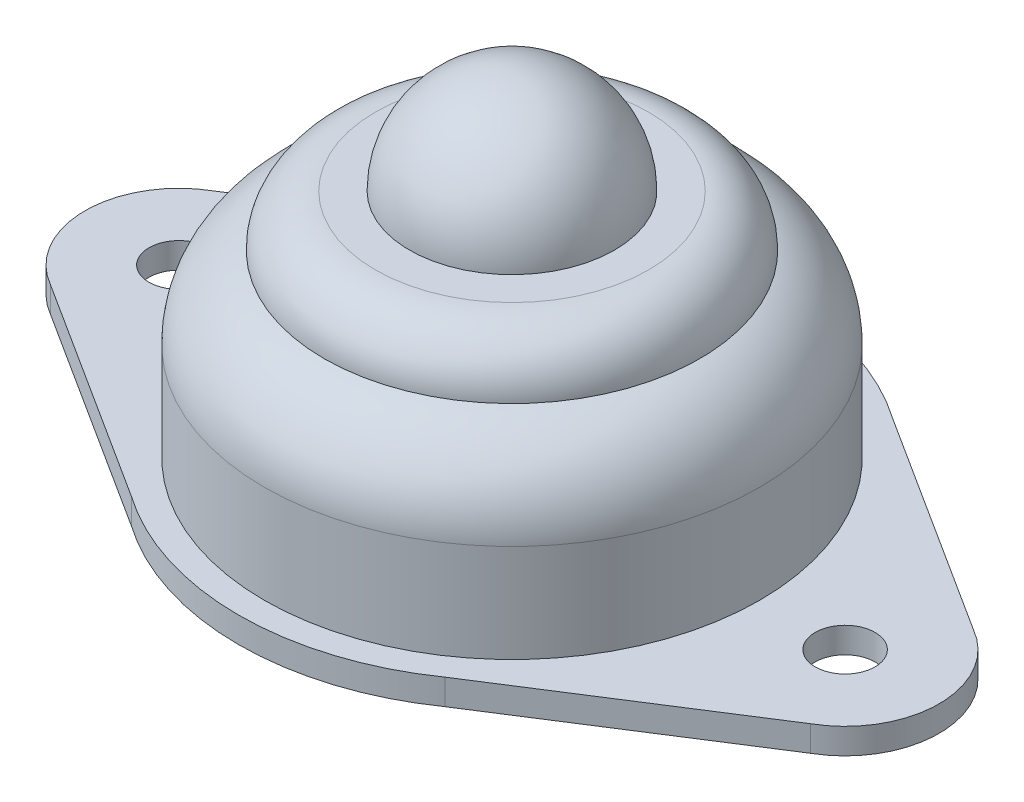
ISO-10303-21;
HEADER;
FILE_DESCRIPTION(('STEP AP214'),'2;1');
FILE_NAME('part.step','',(''),(''),'','','');
FILE_SCHEMA(('AUTOMOTIVE_DESIGN { 1 0 10303 214 1 1 1 1 }'));
ENDSEC;
DATA;
#1=APPLICATION_CONTEXT('core data for automotive mechanical design processes');
#2=APPLICATION_PROTOCOL_DEFINITION('international standard','automotive_design',2000,#1);
#3=PRODUCT_CONTEXT('',#1,'mechanical');
#4=PRODUCT('Part','Part','',(#3));
#5=PRODUCT_RELATED_PRODUCT_CATEGORY('part','',(#4));
#6=PRODUCT_DEFINITION_FORMATION('','',#4);
#7=PRODUCT_DEFINITION_CONTEXT('part definition',#1,'design');
#8=PRODUCT_DEFINITION('design','',#6,#7);
#9=PRODUCT_DEFINITION_SHAPE('','',#8);
#10=(LENGTH_UNIT() NAMED_UNIT(*) SI_UNIT(.MILLI.,.METRE.));
#11=(NAMED_UNIT(*) PLANE_ANGLE_UNIT() SI_UNIT($,.RADIAN.));
#12=(NAMED_UNIT(*) SI_UNIT($,.STERADIAN.) SOLID_ANGLE_UNIT());
#13=UNCERTAINTY_MEASURE_WITH_UNIT(LENGTH_MEASURE(1.E-05),#10,'distance_accuracy_value','');
#14=(GEOMETRIC_REPRESENTATION_CONTEXT(3) GLOBAL_UNCERTAINTY_ASSIGNED_CONTEXT((#13)) GLOBAL_UNIT_ASSIGNED_CONTEXT((#10,
#11,#12)) REPRESENTATION_CONTEXT('',''));
#15=CARTESIAN_POINT('',(0.,0.,0.));
#16=DIRECTION('',(0.,0.,1.));
#17=DIRECTION('',(1.,0.,0.));
#18=AXIS2_PLACEMENT_3D('',#15,#16,#17);
#19=CARTESIAN_POINT('',(0.,1.5,0.));
#20=DIRECTION('',(0.,1.,0.));
#21=DIRECTION('',(0.,0.,1.));
#22=AXIS2_PLACEMENT_3D('',#19,#20,#21);
#23=PLANE('',#22);
#24=CARTESIAN_POINT('',(0.,1.5,0.));
#25=DIRECTION('',(0.,1.,0.));
#26=DIRECTION('',(0.,0.,1.));
#27=AXIS2_PLACEMENT_3D('',#24,#25,#26);
#28=CIRCLE('',#27,14.5);
#29=CARTESIAN_POINT('',(0.,1.5,-14.5));
#30=VERTEX_POINT('',#29);
#31=EDGE_CURVE('E173',#30,#30,#28,.T.);
#32=ORIENTED_EDGE('',*,*,#31,.F.);
#33=EDGE_LOOP('',(#32));
#34=FACE_BOUND('',#33,.T.);
#35=CARTESIAN_POINT('',(-19.5,1.5,0.));
#36=DIRECTION('',(0.,1.,0.));
#37=DIRECTION('',(0.,0.,1.));
#38=AXIS2_PLACEMENT_3D('',#35,#36,#37);
#39=CIRCLE('',#38,1.75);
#40=CARTESIAN_POINT('',(-19.5,1.5,1.75));
#41=VERTEX_POINT('',#40);
#42=EDGE_CURVE('E137',#41,#41,#39,.T.);
#43=ORIENTED_EDGE('',*,*,#42,.F.);
#44=EDGE_LOOP('',(#43));
#45=FACE_BOUND('',#44,.T.);
#46=CARTESIAN_POINT('',(0.,1.5,0.));
#47=DIRECTION('',(0.,1.,0.));
#48=DIRECTION('',(0.,0.,1.));
#49=AXIS2_PLACEMENT_3D('',#46,#47,#48);
#50=CIRCLE('',#49,16.);
#51=CARTESIAN_POINT('',(-9.17722298161676,1.5,13.1064327086239));
#52=VERTEX_POINT('',#51);
#53=CARTESIAN_POINT('',(9.17722298161676,1.5,13.1064327086239));
#54=VERTEX_POINT('',#53);
#55=EDGE_CURVE('E148',#52,#54,#50,.T.);
#56=ORIENTED_EDGE('',*,*,#55,.T.);
#57=DIRECTION('',(0.842952410313412,0.,-0.537988135507474));
#58=VECTOR('',#57,1.);
#59=CARTESIAN_POINT('',(22.25,1.5,4.76313972081441));
#60=LINE('',#59,#58);
#61=CARTESIAN_POINT('',(22.25,1.5,4.7631397208144));
#62=VERTEX_POINT('',#61);
#63=EDGE_CURVE('E96',#54,#62,#60,.T.);
#64=ORIENTED_EDGE('',*,*,#63,.T.);
#65=CARTESIAN_POINT('',(19.5,1.5,0.));
#66=DIRECTION('',(0.,1.,0.));
#67=DIRECTION('',(0.,0.,1.));
#68=AXIS2_PLACEMENT_3D('',#65,#66,#67);
#69=CIRCLE('',#68,5.5);
#70=CARTESIAN_POINT('',(22.25,1.5,-4.76313972081441));
#71=VERTEX_POINT('',#70);
#72=EDGE_CURVE('E189',#62,#71,#69,.T.);
#73=ORIENTED_EDGE('',*,*,#72,.T.);
#74=DIRECTION('',(-0.842952410313412,0.,-0.537988135507474));
#75=VECTOR('',#74,1.);
#76=CARTESIAN_POINT('',(22.25,1.5,-4.76313972081441));
#77=LINE('',#76,#75);
#78=CARTESIAN_POINT('',(9.17722298161676,1.5,-13.1064327086239));
#79=VERTEX_POINT('',#78);
#80=EDGE_CURVE('E191',#71,#79,#77,.T.);
#81=ORIENTED_EDGE('',*,*,#80,.T.);
#82=CARTESIAN_POINT('',(0.,1.5,0.));
#83=DIRECTION('',(0.,1.,0.));
#84=DIRECTION('',(0.,0.,1.));
#85=AXIS2_PLACEMENT_3D('',#82,#83,#84);
#86=CIRCLE('',#85,16.);
#87=CARTESIAN_POINT('',(-9.17722298161676,1.5,-13.1064327086239));
#88=VERTEX_POINT('',#87);
#89=EDGE_CURVE('E115',#79,#88,#86,.T.);
#90=ORIENTED_EDGE('',*,*,#89,.T.);
#91=DIRECTION('',(-0.842952410313412,0.,0.537988135507474));
#92=VECTOR('',#91,1.);
#93=CARTESIAN_POINT('',(-22.25,1.5,-4.76313972081441));
#94=LINE('',#93,#92);
#95=CARTESIAN_POINT('',(-22.25,1.5,-4.76313972081441));
#96=VERTEX_POINT('',#95);
#97=EDGE_CURVE('E109',#88,#96,#94,.T.);
#98=ORIENTED_EDGE('',*,*,#97,.T.);
#99=CARTESIAN_POINT('',(-19.5,1.5,0.));
#100=DIRECTION('',(0.,1.,0.));
#101=DIRECTION('',(0.,0.,1.));
#102=AXIS2_PLACEMENT_3D('',#99,#100,#101);
#103=CIRCLE('',#102,5.5);
#104=CARTESIAN_POINT('',(-22.25,1.5,4.76313972081441));
#105=VERTEX_POINT('',#104);
#106=EDGE_CURVE('E113',#96,#105,#103,.T.);
#107=ORIENTED_EDGE('',*,*,#106,.T.);
#108=DIRECTION('',(0.842952410313412,0.,0.537988135507474));
#109=VECTOR('',#108,1.);
#110=CARTESIAN_POINT('',(-22.25,1.5,4.76313972081441));
#111=LINE('',#110,#109);
#112=EDGE_CURVE('E52',#105,#52,#111,.T.);
#113=ORIENTED_EDGE('',*,*,#112,.T.);
#114=EDGE_LOOP('',(#56,#64,#73,#81,#90,#98,#107,#113));
#115=FACE_BOUND('',#114,.T.);
#116=CARTESIAN_POINT('',(19.5,1.5,0.));
#117=DIRECTION('',(0.,1.,0.));
#118=DIRECTION('',(0.,0.,1.));
#119=AXIS2_PLACEMENT_3D('',#116,#117,#118);
#120=CIRCLE('',#119,1.75);
#121=CARTESIAN_POINT('',(19.5,1.5,1.74999999999999));
#122=VERTEX_POINT('',#121);
#123=EDGE_CURVE('E177',#122,#122,#120,.T.);
#124=ORIENTED_EDGE('',*,*,#123,.F.);
#125=EDGE_LOOP('',(#124));
#126=FACE_BOUND('',#125,.T.);
#127=ADVANCED_FACE('F35',(#34,#45,#115,#126),#23,.T.);
#128=CARTESIAN_POINT('',(0.,0.,0.));
#129=DIRECTION('',(0.,1.,0.));
#130=DIRECTION('',(0.,0.,1.));
#131=AXIS2_PLACEMENT_3D('',#128,#129,#130);
#132=PLANE('',#131);
#133=CARTESIAN_POINT('',(0.,0.,0.));
#134=DIRECTION('',(0.,1.,0.));
#135=DIRECTION('',(0.,0.,1.));
#136=AXIS2_PLACEMENT_3D('',#133,#134,#135);
#137=CIRCLE('',#136,16.);
#138=CARTESIAN_POINT('',(-9.17722298161676,0.,13.1064327086239));
#139=VERTEX_POINT('',#138);
#140=CARTESIAN_POINT('',(9.17722298161676,0.,13.1064327086239));
#141=VERTEX_POINT('',#140);
#142=EDGE_CURVE('E133',#139,#141,#137,.T.);
#143=ORIENTED_EDGE('',*,*,#142,.F.);
#144=DIRECTION('',(0.842952410313412,0.,0.537988135507474));
#145=VECTOR('',#144,1.);
#146=CARTESIAN_POINT('',(-22.25,0.,4.76313972081441));
#147=LINE('',#146,#145);
#148=CARTESIAN_POINT('',(-22.25,0.,4.76313972081441));
#149=VERTEX_POINT('',#148);
#150=EDGE_CURVE('E87',#149,#139,#147,.T.);
#151=ORIENTED_EDGE('',*,*,#150,.F.);
#152=CARTESIAN_POINT('',(-19.5,0.,0.));
#153=DIRECTION('',(0.,1.,0.));
#154=DIRECTION('',(0.,0.,1.));
#155=AXIS2_PLACEMENT_3D('',#152,#153,#154);
#156=CIRCLE('',#155,5.5);
#157=CARTESIAN_POINT('',(-22.25,0.,-4.76313972081441));
#158=VERTEX_POINT('',#157);
#159=EDGE_CURVE('E81',#158,#149,#156,.T.);
#160=ORIENTED_EDGE('',*,*,#159,.F.);
#161=DIRECTION('',(-0.842952410313412,0.,0.537988135507474));
#162=VECTOR('',#161,1.);
#163=CARTESIAN_POINT('',(-22.25,0.,-4.76313972081441));
#164=LINE('',#163,#162);
#165=CARTESIAN_POINT('',(-9.17722298161676,0.,-13.1064327086239));
#166=VERTEX_POINT('',#165);
#167=EDGE_CURVE('E123',#166,#158,#164,.T.);
#168=ORIENTED_EDGE('',*,*,#167,.F.);
#169=CARTESIAN_POINT('',(0.,0.,0.));
#170=DIRECTION('',(0.,1.,0.));
#171=DIRECTION('',(0.,0.,1.));
#172=AXIS2_PLACEMENT_3D('',#169,#170,#171);
#173=CIRCLE('',#172,16.);
#174=CARTESIAN_POINT('',(9.17722298161676,0.,-13.1064327086239));
#175=VERTEX_POINT('',#174);
#176=EDGE_CURVE('E143',#175,#166,#173,.T.);
#177=ORIENTED_EDGE('',*,*,#176,.F.);
#178=DIRECTION('',(-0.842952410313412,0.,-0.537988135507474));
#179=VECTOR('',#178,1.);
#180=CARTESIAN_POINT('',(22.25,0.,-4.76313972081441));
#181=LINE('',#180,#179);
#182=CARTESIAN_POINT('',(22.25,0.,-4.76313972081441));
#183=VERTEX_POINT('',#182);
#184=EDGE_CURVE('E141',#183,#175,#181,.T.);
#185=ORIENTED_EDGE('',*,*,#184,.F.);
#186=CARTESIAN_POINT('',(19.5,0.,0.));
#187=DIRECTION('',(0.,1.,0.));
#188=DIRECTION('',(0.,0.,1.));
#189=AXIS2_PLACEMENT_3D('',#186,#187,#188);
#190=CIRCLE('',#189,5.5);
#191=CARTESIAN_POINT('',(22.25,0.,4.7631397208144));
#192=VERTEX_POINT('',#191);
#193=EDGE_CURVE('E139',#192,#183,#190,.T.);
#194=ORIENTED_EDGE('',*,*,#193,.F.);
#195=DIRECTION('',(0.842952410313412,0.,-0.537988135507474));
#196=VECTOR('',#195,1.);
#197=CARTESIAN_POINT('',(22.25,0.,4.76313972081441));
#198=LINE('',#197,#196);
#199=EDGE_CURVE('E136',#141,#192,#198,.T.);
#200=ORIENTED_EDGE('',*,*,#199,.F.);
#201=EDGE_LOOP('',(#143,#151,#160,#168,#177,#185,#194,#200));
#202=FACE_BOUND('',#201,.T.);
#203=CARTESIAN_POINT('',(-19.5,0.,0.));
#204=DIRECTION('',(0.,1.,0.));
#205=DIRECTION('',(0.,0.,1.));
#206=AXIS2_PLACEMENT_3D('',#203,#204,#205);
#207=CIRCLE('',#206,1.75);
#208=CARTESIAN_POINT('',(-19.5,0.,1.75));
#209=VERTEX_POINT('',#208);
#210=EDGE_CURVE('E180',#209,#209,#207,.T.);
#211=ORIENTED_EDGE('',*,*,#210,.T.);
#212=EDGE_LOOP('',(#211));
#213=FACE_BOUND('',#212,.T.);
#214=CARTESIAN_POINT('',(19.5,0.,0.));
#215=DIRECTION('',(0.,1.,0.));
#216=DIRECTION('',(0.,0.,1.));
#217=AXIS2_PLACEMENT_3D('',#214,#215,#216);
#218=CIRCLE('',#217,1.75);
#219=CARTESIAN_POINT('',(19.5,0.,1.74999999999999));
#220=VERTEX_POINT('',#219);
#221=EDGE_CURVE('E176',#220,#220,#218,.T.);
#222=ORIENTED_EDGE('',*,*,#221,.T.);
#223=EDGE_LOOP('',(#222));
#224=FACE_BOUND('',#223,.T.);
#225=ADVANCED_FACE('F204',(#202,#213,#224),#132,.F.);
#226=CARTESIAN_POINT('',(0.,1.5,0.));
#227=DIRECTION('',(0.,-1.,0.));
#228=DIRECTION('',(0.,0.,-1.));
#229=AXIS2_PLACEMENT_3D('',#226,#227,#228);
#230=CYLINDRICAL_SURFACE('',#229,16.);
#231=ORIENTED_EDGE('',*,*,#142,.T.);
#232=DIRECTION('',(0.,-1.,0.));
#233=VECTOR('',#232,1.);
#234=CARTESIAN_POINT('',(9.17722298161676,1.5,13.1064327086239));
#235=LINE('',#234,#233);
#236=EDGE_CURVE('E161',#54,#141,#235,.T.);
#237=ORIENTED_EDGE('',*,*,#236,.F.);
#238=ORIENTED_EDGE('',*,*,#55,.F.);
#239=DIRECTION('',(0.,-1.,0.));
#240=VECTOR('',#239,1.);
#241=CARTESIAN_POINT('',(-9.17722298161676,1.5,13.1064327086239));
#242=LINE('',#241,#240);
#243=EDGE_CURVE('E129',#52,#139,#242,.T.);
#244=ORIENTED_EDGE('',*,*,#243,.T.);
#245=EDGE_LOOP('',(#231,#237,#238,#244));
#246=FACE_BOUND('',#245,.T.);
#247=ADVANCED_FACE('F209',(#246),#230,.T.);
#248=CARTESIAN_POINT('',(22.25,1.5,4.76313972081441));
#249=DIRECTION('',(-0.537988135507474,0.,-0.842952410313412));
#250=DIRECTION('',(-0.842952410313412,0.,0.537988135507474));
#251=AXIS2_PLACEMENT_3D('',#248,#249,#250);
#252=PLANE('',#251);
#253=ORIENTED_EDGE('',*,*,#199,.T.);
#254=DIRECTION('',(0.,-1.,0.));
#255=VECTOR('',#254,1.);
#256=CARTESIAN_POINT('',(22.25,1.5,4.7631397208144));
#257=LINE('',#256,#255);
#258=EDGE_CURVE('E158',#62,#192,#257,.T.);
#259=ORIENTED_EDGE('',*,*,#258,.F.);
#260=ORIENTED_EDGE('',*,*,#63,.F.);
#261=ORIENTED_EDGE('',*,*,#236,.T.);
#262=EDGE_LOOP('',(#253,#259,#260,#261));
#263=FACE_BOUND('',#262,.T.);
#264=ADVANCED_FACE('F261',(#263),#252,.F.);
#265=CARTESIAN_POINT('',(19.5,1.5,0.));
#266=DIRECTION('',(0.,-1.,0.));
#267=DIRECTION('',(0.,0.,-1.));
#268=AXIS2_PLACEMENT_3D('',#265,#266,#267);
#269=CYLINDRICAL_SURFACE('',#268,5.5);
#270=ORIENTED_EDGE('',*,*,#193,.T.);
#271=DIRECTION('',(0.,-1.,0.));
#272=VECTOR('',#271,1.);
#273=CARTESIAN_POINT('',(22.25,1.5,-4.76313972081441));
#274=LINE('',#273,#272);
#275=EDGE_CURVE('E155',#71,#183,#274,.T.);
#276=ORIENTED_EDGE('',*,*,#275,.F.);
#277=ORIENTED_EDGE('',*,*,#72,.F.);
#278=ORIENTED_EDGE('',*,*,#258,.T.);
#279=EDGE_LOOP('',(#270,#276,#277,#278));
#280=FACE_BOUND('',#279,.T.);
#281=ADVANCED_FACE('F264',(#280),#269,.T.);
#282=CARTESIAN_POINT('',(22.25,1.5,-4.76313972081441));
#283=DIRECTION('',(-0.537988135507474,0.,0.842952410313412));
#284=DIRECTION('',(0.842952410313412,0.,0.537988135507474));
#285=AXIS2_PLACEMENT_3D('',#282,#283,#284);
#286=PLANE('',#285);
#287=ORIENTED_EDGE('',*,*,#184,.T.);
#288=DIRECTION('',(0.,-1.,0.));
#289=VECTOR('',#288,1.);
#290=CARTESIAN_POINT('',(9.17722298161676,1.5,-13.1064327086239));
#291=LINE('',#290,#289);
#292=EDGE_CURVE('E152',#79,#175,#291,.T.);
#293=ORIENTED_EDGE('',*,*,#292,.F.);
#294=ORIENTED_EDGE('',*,*,#80,.F.);
#295=ORIENTED_EDGE('',*,*,#275,.T.);
#296=EDGE_LOOP('',(#287,#293,#294,#295));
#297=FACE_BOUND('',#296,.T.);
#298=ADVANCED_FACE('F197',(#297),#286,.F.);
#299=CARTESIAN_POINT('',(0.,1.5,0.));
#300=DIRECTION('',(0.,-1.,0.));
#301=DIRECTION('',(0.,0.,-1.));
#302=AXIS2_PLACEMENT_3D('',#299,#300,#301);
#303=CYLINDRICAL_SURFACE('',#302,16.);
#304=ORIENTED_EDGE('',*,*,#176,.T.);
#305=DIRECTION('',(0.,-1.,0.));
#306=VECTOR('',#305,1.);
#307=CARTESIAN_POINT('',(-9.17722298161676,1.5,-13.1064327086239));
#308=LINE('',#307,#306);
#309=EDGE_CURVE('E124',#88,#166,#308,.T.);
#310=ORIENTED_EDGE('',*,*,#309,.F.);
#311=ORIENTED_EDGE('',*,*,#89,.F.);
#312=ORIENTED_EDGE('',*,*,#292,.T.);
#313=EDGE_LOOP('',(#304,#310,#311,#312));
#314=FACE_BOUND('',#313,.T.);
#315=ADVANCED_FACE('F201',(#314),#303,.T.);
#316=CARTESIAN_POINT('',(-22.25,1.5,-4.76313972081441));
#317=DIRECTION('',(0.537988135507474,0.,0.842952410313412));
#318=DIRECTION('',(0.842952410313412,0.,-0.537988135507474));
#319=AXIS2_PLACEMENT_3D('',#316,#317,#318);
#320=PLANE('',#319);
#321=ORIENTED_EDGE('',*,*,#167,.T.);
#322=DIRECTION('',(0.,-1.,0.));
#323=VECTOR('',#322,1.);
#324=CARTESIAN_POINT('',(-22.25,1.5,-4.76313972081441));
#325=LINE('',#324,#323);
#326=EDGE_CURVE('E120',#96,#158,#325,.T.);
#327=ORIENTED_EDGE('',*,*,#326,.F.);
#328=ORIENTED_EDGE('',*,*,#97,.F.);
#329=ORIENTED_EDGE('',*,*,#309,.T.);
#330=EDGE_LOOP('',(#321,#327,#328,#329));
#331=FACE_BOUND('',#330,.T.);
#332=ADVANCED_FACE('F121',(#331),#320,.F.);
#333=CARTESIAN_POINT('',(-19.5,1.5,0.));
#334=DIRECTION('',(0.,-1.,0.));
#335=DIRECTION('',(0.,0.,-1.));
#336=AXIS2_PLACEMENT_3D('',#333,#334,#335);
#337=CYLINDRICAL_SURFACE('',#336,5.5);
#338=ORIENTED_EDGE('',*,*,#159,.T.);
#339=DIRECTION('',(0.,-1.,0.));
#340=VECTOR('',#339,1.);
#341=CARTESIAN_POINT('',(-22.25,1.5,4.76313972081441));
#342=LINE('',#341,#340);
#343=EDGE_CURVE('E125',#105,#149,#342,.T.);
#344=ORIENTED_EDGE('',*,*,#343,.F.);
#345=ORIENTED_EDGE('',*,*,#106,.F.);
#346=ORIENTED_EDGE('',*,*,#326,.T.);
#347=EDGE_LOOP('',(#338,#344,#345,#346));
#348=FACE_BOUND('',#347,.T.);
#349=ADVANCED_FACE('F127',(#348),#337,.T.);
#350=CARTESIAN_POINT('',(-22.25,1.5,4.76313972081441));
#351=DIRECTION('',(0.537988135507474,0.,-0.842952410313412));
#352=DIRECTION('',(-0.842952410313412,0.,-0.537988135507474));
#353=AXIS2_PLACEMENT_3D('',#350,#351,#352);
#354=PLANE('',#353);
#355=ORIENTED_EDGE('',*,*,#150,.T.);
#356=ORIENTED_EDGE('',*,*,#243,.F.);
#357=ORIENTED_EDGE('',*,*,#112,.F.);
#358=ORIENTED_EDGE('',*,*,#343,.T.);
#359=EDGE_LOOP('',(#355,#356,#357,#358));
#360=FACE_BOUND('',#359,.T.);
#361=ADVANCED_FACE('F211',(#360),#354,.F.);
#362=CARTESIAN_POINT('',(-19.5,1.5,0.));
#363=DIRECTION('',(0.,-1.,0.));
#364=DIRECTION('',(0.,0.,-1.));
#365=AXIS2_PLACEMENT_3D('',#362,#363,#364);
#366=CYLINDRICAL_SURFACE('',#365,1.75);
#367=ORIENTED_EDGE('',*,*,#42,.T.);
#368=EDGE_LOOP('',(#367));
#369=FACE_BOUND('',#368,.T.);
#370=ORIENTED_EDGE('',*,*,#210,.F.);
#371=EDGE_LOOP('',(#370));
#372=FACE_BOUND('',#371,.T.);
#373=ADVANCED_FACE('F213',(#369,#372),#366,.F.);
#374=CARTESIAN_POINT('',(19.5,1.5,0.));
#375=DIRECTION('',(0.,-1.,0.));
#376=DIRECTION('',(0.,0.,-1.));
#377=AXIS2_PLACEMENT_3D('',#374,#375,#376);
#378=CYLINDRICAL_SURFACE('',#377,1.75);
#379=ORIENTED_EDGE('',*,*,#123,.T.);
#380=EDGE_LOOP('',(#379));
#381=FACE_BOUND('',#380,.T.);
#382=ORIENTED_EDGE('',*,*,#221,.F.);
#383=EDGE_LOOP('',(#382));
#384=FACE_BOUND('',#383,.T.);
#385=ADVANCED_FACE('F219',(#381,#384),#378,.F.);
#386=CARTESIAN_POINT('',(0.,12.,0.));
#387=DIRECTION('',(0.,-1.,0.));
#388=DIRECTION('',(0.,0.,-1.));
#389=AXIS2_PLACEMENT_3D('',#386,#387,#388);
#390=CYLINDRICAL_SURFACE('',#389,14.5);
#391=CARTESIAN_POINT('',(0.,7.23030399291527,0.));
#392=DIRECTION('',(0.,1.,0.));
#393=DIRECTION('',(0.,0.,1.));
#394=AXIS2_PLACEMENT_3D('',#391,#392,#393);
#395=CIRCLE('',#394,14.5);
#396=CARTESIAN_POINT('',(0.,7.23030399291527,-14.5));
#397=VERTEX_POINT('',#396);
#398=EDGE_CURVE('E44',#397,#397,#395,.F.);
#399=CARTESIAN_POINT('',(0.,7.23030399291527,-14.5));
#400=CARTESIAN_POINT('',(0.,7.1706133263224,-14.5));
#401=CARTESIAN_POINT('',(0.,7.11092265972954,-14.5));
#402=CARTESIAN_POINT('',(0.,6.9915413265438,-14.5));
#403=CARTESIAN_POINT('',(0.,6.93185065995093,-14.5));
#404=CARTESIAN_POINT('',(0.,6.8124693267652,-14.5));
#405=CARTESIAN_POINT('',(0.,6.75277866017233,-14.5));
#406=CARTESIAN_POINT('',(0.,6.6333973269866,-14.5));
#407=CARTESIAN_POINT('',(0.,6.57370666039373,-14.5));
#408=CARTESIAN_POINT('',(0.,6.45432532720799,-14.5));
#409=CARTESIAN_POINT('',(0.,6.39463466061513,-14.5));
#410=CARTESIAN_POINT('',(0.,6.27525332742939,-14.5));
#411=CARTESIAN_POINT('',(0.,6.21556266083652,-14.5));
#412=CARTESIAN_POINT('',(0.,6.09618132765079,-14.5));
#413=CARTESIAN_POINT('',(0.,6.03649066105792,-14.5));
#414=CARTESIAN_POINT('',(0.,5.91710932787219,-14.5));
#415=CARTESIAN_POINT('',(0.,5.85741866127932,-14.5));
#416=CARTESIAN_POINT('',(0.,5.73803732809358,-14.5));
#417=CARTESIAN_POINT('',(0.,5.67834666150072,-14.5));
#418=CARTESIAN_POINT('',(0.,5.55896532831498,-14.5));
#419=CARTESIAN_POINT('',(0.,5.49927466172212,-14.5));
#420=CARTESIAN_POINT('',(0.,5.37989332853638,-14.5));
#421=CARTESIAN_POINT('',(0.,5.32020266194351,-14.5));
#422=CARTESIAN_POINT('',(0.,5.20082132875778,-14.5));
#423=CARTESIAN_POINT('',(0.,5.14113066216491,-14.5));
#424=CARTESIAN_POINT('',(0.,5.02174932897918,-14.5));
#425=CARTESIAN_POINT('',(0.,4.96205866238631,-14.5));
#426=CARTESIAN_POINT('',(0.,4.84267732920057,-14.5));
#427=CARTESIAN_POINT('',(0.,4.78298666260771,-14.5));
#428=CARTESIAN_POINT('',(0.,4.66360532942197,-14.5));
#429=CARTESIAN_POINT('',(0.,4.6039146628291,-14.5));
#430=CARTESIAN_POINT('',(0.,4.48453332964337,-14.5));
#431=CARTESIAN_POINT('',(0.,4.4248426630505,-14.5));
#432=CARTESIAN_POINT('',(0.,4.30546132986477,-14.5));
#433=CARTESIAN_POINT('',(0.,4.2457706632719,-14.5));
#434=CARTESIAN_POINT('',(0.,4.12638933008617,-14.5));
#435=CARTESIAN_POINT('',(0.,4.0666986634933,-14.5));
#436=CARTESIAN_POINT('',(0.,3.94731733030756,-14.5));
#437=CARTESIAN_POINT('',(0.,3.8876266637147,-14.5));
#438=CARTESIAN_POINT('',(0.,3.76824533052896,-14.5));
#439=CARTESIAN_POINT('',(0.,3.70855466393609,-14.5));
#440=CARTESIAN_POINT('',(0.,3.58917333075036,-14.5));
#441=CARTESIAN_POINT('',(0.,3.52948266415749,-14.5));
#442=CARTESIAN_POINT('',(0.,3.41010133097176,-14.5));
#443=CARTESIAN_POINT('',(0.,3.35041066437889,-14.5));
#444=CARTESIAN_POINT('',(0.,3.23102933119316,-14.5));
#445=CARTESIAN_POINT('',(0.,3.17133866460029,-14.5));
#446=CARTESIAN_POINT('',(0.,3.05195733141455,-14.5));
#447=CARTESIAN_POINT('',(0.,2.99226666482168,-14.5));
#448=CARTESIAN_POINT('',(0.,2.87288533163595,-14.5));
#449=CARTESIAN_POINT('',(0.,2.81319466504308,-14.5));
#450=CARTESIAN_POINT('',(0.,2.69381333185735,-14.5));
#451=CARTESIAN_POINT('',(0.,2.63412266526448,-14.5));
#452=CARTESIAN_POINT('',(0.,2.51474133207875,-14.5));
#453=CARTESIAN_POINT('',(0.,2.45505066548588,-14.5));
#454=CARTESIAN_POINT('',(0.,2.33566933230014,-14.5));
#455=CARTESIAN_POINT('',(0.,2.27597866570728,-14.5));
#456=CARTESIAN_POINT('',(0.,2.15659733252154,-14.5));
#457=CARTESIAN_POINT('',(0.,2.09690666592867,-14.5));
#458=CARTESIAN_POINT('',(0.,1.97752533274294,-14.5));
#459=CARTESIAN_POINT('',(0.,1.91783466615007,-14.5));
#460=CARTESIAN_POINT('',(0.,1.79845333296434,-14.5));
#461=CARTESIAN_POINT('',(0.,1.73876266637147,-14.5));
#462=CARTESIAN_POINT('',(0.,1.61938133318573,-14.5));
#463=CARTESIAN_POINT('',(0.,1.55969066659287,-14.5));
#464=CARTESIAN_POINT('',(0.,1.5,-14.5));
#465=B_SPLINE_CURVE_WITH_KNOTS('',3,(#399,#400,#401,#402,#403,#404,#405,#406,#407,#408,#409,
#410,#411,#412,#413,#414,#415,#416,#417,#418,#419,#420,#421,#422,#423,#424,#425,#426,#427,#428,
#429,#430,#431,#432,#433,#434,#435,#436,#437,#438,#439,#440,#441,#442,#443,#444,#445,#446,#447,
#448,#449,#450,#451,#452,#453,#454,#455,#456,#457,#458,#459,#460,#461,#462,#463,#464),
.UNSPECIFIED.,.F.,.F.,(4,2,2,2,2,2,2,2,2,2,2,2,2,2,2,2,2,2,2,2,2,2,2,2,2,2,2,2,2,2,2,2,4),(0.,
0.179071999778602,0.358143999557204,0.537215999335807,0.716287999114409,0.895359998893011,
1.07443199867161,1.25350399845022,1.43257599822882,1.61164799800742,1.79071999778602,
1.96979199756462,2.14886399734323,2.32793599712183,2.50700799690043,2.68607999667903,
2.86515199645764,3.04422399623624,3.22329599601484,3.40236799579344,3.58143999557204,
3.76051199535065,3.93958399512925,4.11865599490785,4.29772799468645,4.47679999446506,
4.65587199424366,4.83494399402226,5.01401599380086,5.19308799357947,5.37215999335807,
5.55123199313667,5.73030399291527),.UNSPECIFIED.);
#466=EDGE_CURVE('BSEAM235',#397,#30,#465,.T.);
#467=ORIENTED_EDGE('',*,*,#398,.T.);
#468=ORIENTED_EDGE('',*,*,#31,.T.);
#469=ORIENTED_EDGE('',*,*,#466,.T.);
#470=ORIENTED_EDGE('',*,*,#466,.F.);
#471=EDGE_LOOP('',(#467,#469,#468,#470));
#472=FACE_BOUND('',#471,.T.);
#473=ADVANCED_FACE('F235',(#472),#390,.T.);
#474=CARTESIAN_POINT('',(0.,15.,0.));
#475=DIRECTION('',(0.,1.,0.));
#476=DIRECTION('',(0.,0.,1.));
#477=AXIS2_PLACEMENT_3D('',#474,#475,#476);
#478=PLANE('',#477);
#479=CARTESIAN_POINT('',(0.,15.,0.));
#480=DIRECTION('',(0.,1.,0.));
#481=DIRECTION('',(0.,0.,1.));
#482=AXIS2_PLACEMENT_3D('',#479,#480,#481);
#483=CIRCLE('',#482,8.);
#484=CARTESIAN_POINT('',(0.,15.,8.));
#485=VERTEX_POINT('',#484);
#486=EDGE_CURVE('E11',#485,#485,#483,.T.);
#487=ORIENTED_EDGE('',*,*,#486,.T.);
#488=EDGE_LOOP('',(#487));
#489=FACE_BOUND('',#488,.T.);
#490=CARTESIAN_POINT('',(0.,15.,0.));
#491=DIRECTION('',(0.,-1.,0.));
#492=DIRECTION('',(0.,0.,-1.));
#493=AXIS2_PLACEMENT_3D('',#490,#491,#492);
#494=CIRCLE('',#493,6.);
#495=CARTESIAN_POINT('',(0.,15.,-6.));
#496=VERTEX_POINT('',#495);
#497=EDGE_CURVE('E172',#496,#496,#494,.T.);
#498=ORIENTED_EDGE('',*,*,#497,.T.);
#499=EDGE_LOOP('',(#498));
#500=FACE_BOUND('',#499,.T.);
#501=ADVANCED_FACE('F239',(#489,#500),#478,.T.);
#502=CARTESIAN_POINT('',(0.,15.,0.));
#503=DIRECTION('',(0.,-1.,0.));
#504=DIRECTION('',(1.,0.,0.));
#505=AXIS2_PLACEMENT_3D('',#502,#503,#504);
#506=SPHERICAL_SURFACE('',#505,6.);
#507=ORIENTED_EDGE('',*,*,#497,.F.);
#508=EDGE_LOOP('',(#507));
#509=FACE_BOUND('',#508,.T.);
#510=ADVANCED_FACE('F242',(#509),#506,.T.);
#511=CARTESIAN_POINT('',(0.,7.23030399291527,0.));
#512=DIRECTION('',(0.,1.,0.));
#513=DIRECTION('',(0.,0.,1.));
#514=AXIS2_PLACEMENT_3D('',#511,#512,#513);
#515=TOROIDAL_SURFACE('',#514,9.5,5.);
#516=ORIENTED_EDGE('',*,*,#398,.F.);
#517=EDGE_LOOP('',(#516));
#518=FACE_BOUND('',#517,.T.);
#519=CARTESIAN_POINT('',(0.,12.,0.));
#520=DIRECTION('',(0.,1.,0.));
#521=DIRECTION('',(0.,0.,1.));
#522=AXIS2_PLACEMENT_3D('',#519,#520,#521);
#523=CIRCLE('',#522,11.);
#524=CARTESIAN_POINT('',(0.,12.,11.));
#525=VERTEX_POINT('',#524);
#526=EDGE_CURVE('E162',#525,#525,#523,.T.);
#527=ORIENTED_EDGE('',*,*,#526,.F.);
#528=EDGE_LOOP('',(#527));
#529=FACE_BOUND('',#528,.T.);
#530=ADVANCED_FACE('F245',(#518,#529),#515,.T.);
#531=CARTESIAN_POINT('',(0.,12.,0.));
#532=DIRECTION('',(0.,1.,0.));
#533=DIRECTION('',(0.,0.,1.));
#534=AXIS2_PLACEMENT_3D('',#531,#532,#533);
#535=TOROIDAL_SURFACE('',#534,8.,3.);
#536=ORIENTED_EDGE('',*,*,#526,.T.);
#537=EDGE_LOOP('',(#536));
#538=FACE_BOUND('',#537,.T.);
#539=ORIENTED_EDGE('',*,*,#486,.F.);
#540=EDGE_LOOP('',(#539));
#541=FACE_BOUND('',#540,.T.);
#542=ADVANCED_FACE('F37',(#538,#541),#535,.T.);
#543=CLOSED_SHELL('',(#127,#225,#247,#264,#281,#298,#315,#332,#349,#361,#373,#385,#473,#501,
#510,#530,#542));
#544=MANIFOLD_SOLID_BREP('B2',#543);
#545=ADVANCED_BREP_SHAPE_REPRESENTATION('',(#18,#544),#14);
#546=SHAPE_DEFINITION_REPRESENTATION(#9,#545);
ENDSEC;
END-ISO-10303-21;
